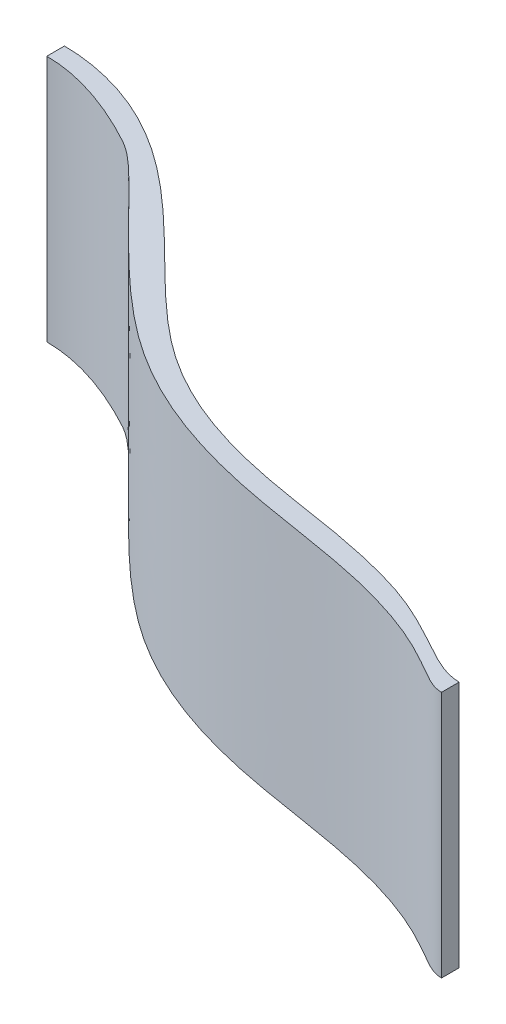
ISO-10303-21;
HEADER;
FILE_DESCRIPTION(('STEP AP214'),'2;1');
FILE_NAME('part.step','',(''),(''),'','','');
FILE_SCHEMA(('AUTOMOTIVE_DESIGN { 1 0 10303 214 1 1 1 1 }'));
ENDSEC;
DATA;
#1=APPLICATION_CONTEXT('core data for automotive mechanical design processes');
#2=APPLICATION_PROTOCOL_DEFINITION('international standard','automotive_design',2000,#1);
#3=PRODUCT_CONTEXT('',#1,'mechanical');
#4=PRODUCT('Part','Part','',(#3));
#5=PRODUCT_RELATED_PRODUCT_CATEGORY('part','',(#4));
#6=PRODUCT_DEFINITION_FORMATION('','',#4);
#7=PRODUCT_DEFINITION_CONTEXT('part definition',#1,'design');
#8=PRODUCT_DEFINITION('design','',#6,#7);
#9=PRODUCT_DEFINITION_SHAPE('','',#8);
#10=(LENGTH_UNIT() NAMED_UNIT(*) SI_UNIT(.MILLI.,.METRE.));
#11=(NAMED_UNIT(*) PLANE_ANGLE_UNIT() SI_UNIT($,.RADIAN.));
#12=(NAMED_UNIT(*) SI_UNIT($,.STERADIAN.) SOLID_ANGLE_UNIT());
#13=UNCERTAINTY_MEASURE_WITH_UNIT(LENGTH_MEASURE(1.E-05),#10,'distance_accuracy_value','');
#14=(GEOMETRIC_REPRESENTATION_CONTEXT(3) GLOBAL_UNCERTAINTY_ASSIGNED_CONTEXT((#13)) GLOBAL_UNIT_ASSIGNED_CONTEXT((#10,
#11,#12)) REPRESENTATION_CONTEXT('',''));
#15=CARTESIAN_POINT('',(0.,0.,0.));
#16=DIRECTION('',(0.,0.,1.));
#17=DIRECTION('',(1.,0.,0.));
#18=AXIS2_PLACEMENT_3D('',#15,#16,#17);
#19=CARTESIAN_POINT('',(0.,420.,-30.));
#20=CARTESIAN_POINT('',(42.1724819660913,420.,-30.));
#21=CARTESIAN_POINT('',(267.885357965047,420.,19.4337878196505));
#22=CARTESIAN_POINT('',(486.469740333777,420.,345.712765109243));
#23=CARTESIAN_POINT('',(745.083096253932,420.,425.526187691134));
#24=CARTESIAN_POINT('',(948.321873855057,420.,455.022483048643));
#25=CARTESIAN_POINT('',(1150.37756470674,420.,495.744478272121));
#26=CARTESIAN_POINT('',(1223.3164034929,420.,570.));
#27=CARTESIAN_POINT('',(1270.,420.,570.));
#28=B_SPLINE_CURVE_WITH_KNOTS('',3,(#19,#20,#21,#22,#23,#24,#25,#26,#27),.UNSPECIFIED.,.F.,.F.,
(4,1,1,1,1,1,4),(0.,0.0847739069405942,0.417203054912309,0.651150272269238,0.68934091943693,
0.799109526589234,1.),.UNSPECIFIED.);
#29=DIRECTION('',(0.,-1.,0.));
#30=VECTOR('',#29,1.);
#31=SURFACE_OF_LINEAR_EXTRUSION('',#28,#30);
#32=CARTESIAN_POINT('',(0.,0.,-30.));
#33=CARTESIAN_POINT('',(42.1724819660913,0.,-30.));
#34=CARTESIAN_POINT('',(267.885357965047,0.,19.4337878196505));
#35=CARTESIAN_POINT('',(486.469740333777,0.,345.712765109243));
#36=CARTESIAN_POINT('',(745.083096253932,0.,425.526187691134));
#37=CARTESIAN_POINT('',(948.321873855057,0.,455.022483048643));
#38=CARTESIAN_POINT('',(1150.37756470674,0.,495.744478272121));
#39=CARTESIAN_POINT('',(1223.3164034929,0.,570.));
#40=CARTESIAN_POINT('',(1270.,0.,570.));
#41=B_SPLINE_CURVE_WITH_KNOTS('',3,(#32,#33,#34,#35,#36,#37,#38,#39,#40),.UNSPECIFIED.,.F.,.F.,
(4,1,1,1,1,1,4),(0.,0.0847739069405942,0.417203054912309,0.651150272269238,0.68934091943693,
0.799109526589234,1.),.UNSPECIFIED.);
#42=CARTESIAN_POINT('',(0.,0.,-30.));
#43=VERTEX_POINT('',#42);
#44=CARTESIAN_POINT('',(1270.,0.,570.));
#45=VERTEX_POINT('',#44);
#46=EDGE_CURVE('E125',#43,#45,#41,.T.);
#47=ORIENTED_EDGE('',*,*,#46,.F.);
#48=DIRECTION('',(0.,-1.,0.));
#49=VECTOR('',#48,1.);
#50=CARTESIAN_POINT('',(0.,420.,-30.));
#51=LINE('',#50,#49);
#52=CARTESIAN_POINT('',(0.,420.,-30.));
#53=VERTEX_POINT('',#52);
#54=EDGE_CURVE('E11',#53,#43,#51,.T.);
#55=ORIENTED_EDGE('',*,*,#54,.F.);
#56=CARTESIAN_POINT('',(1270.,420.,570.));
#57=VERTEX_POINT('',#56);
#58=EDGE_CURVE('E99',#53,#57,#28,.T.);
#59=ORIENTED_EDGE('',*,*,#58,.T.);
#60=DIRECTION('',(0.,-1.,0.));
#61=VECTOR('',#60,1.);
#62=CARTESIAN_POINT('',(1270.,420.,570.));
#63=LINE('',#62,#61);
#64=EDGE_CURVE('E80',#57,#45,#63,.T.);
#65=ORIENTED_EDGE('',*,*,#64,.T.);
#66=EDGE_LOOP('',(#47,#55,#59,#65));
#67=FACE_BOUND('',#66,.T.);
#68=ADVANCED_FACE('F41',(#67),#31,.T.);
#69=CARTESIAN_POINT('',(0.,420.,0.));
#70=DIRECTION('',(-1.,0.,0.));
#71=DIRECTION('',(0.,0.,1.));
#72=AXIS2_PLACEMENT_3D('',#69,#70,#71);
#73=PLANE('',#72);
#74=DIRECTION('',(0.,0.,-1.));
#75=VECTOR('',#74,1.);
#76=CARTESIAN_POINT('',(0.,0.,0.));
#77=LINE('',#76,#75);
#78=CARTESIAN_POINT('',(0.,0.,0.));
#79=VERTEX_POINT('',#78);
#80=EDGE_CURVE('E93',#79,#43,#77,.T.);
#81=ORIENTED_EDGE('',*,*,#80,.F.);
#82=DIRECTION('',(0.,-1.,0.));
#83=VECTOR('',#82,1.);
#84=CARTESIAN_POINT('',(0.,420.,0.));
#85=LINE('',#84,#83);
#86=CARTESIAN_POINT('',(0.,420.,0.));
#87=VERTEX_POINT('',#86);
#88=EDGE_CURVE('E50',#87,#79,#85,.T.);
#89=ORIENTED_EDGE('',*,*,#88,.F.);
#90=DIRECTION('',(0.,0.,-1.));
#91=VECTOR('',#90,1.);
#92=CARTESIAN_POINT('',(0.,420.,0.));
#93=LINE('',#92,#91);
#94=EDGE_CURVE('E91',#87,#53,#93,.T.);
#95=ORIENTED_EDGE('',*,*,#94,.T.);
#96=ORIENTED_EDGE('',*,*,#54,.T.);
#97=EDGE_LOOP('',(#81,#89,#95,#96));
#98=FACE_BOUND('',#97,.T.);
#99=ADVANCED_FACE('F89',(#98),#73,.T.);
#100=CARTESIAN_POINT('',(0.,420.,0.));
#101=CARTESIAN_POINT('',(63.9163152195224,420.,0.));
#102=CARTESIAN_POINT('',(150.210740563594,420.,38.8706557041555));
#103=CARTESIAN_POINT('',(245.199863378563,420.,90.9746521025318));
#104=CARTESIAN_POINT('',(512.561266581365,420.,420.540297934127));
#105=CARTESIAN_POINT('',(858.814807696552,420.,476.037260949209));
#106=CARTESIAN_POINT('',(1192.61413834726,420.,530.302900736237));
#107=CARTESIAN_POINT('',(1228.94531405517,420.,600.000000000001));
#108=CARTESIAN_POINT('',(1270.,420.,600.));
#109=B_SPLINE_CURVE_WITH_KNOTS('',3,(#100,#101,#102,#103,#104,#105,#106,#107,#108),
.UNSPECIFIED.,.F.,.F.,(4,1,1,1,1,1,4),(0.,0.117725014404624,0.147165532644825,0.294405182402003,
0.459333825022082,0.529893306781882,1.),.UNSPECIFIED.);
#110=DIRECTION('',(0.,-1.,0.));
#111=VECTOR('',#110,1.);
#112=SURFACE_OF_LINEAR_EXTRUSION('',#109,#111);
#113=CARTESIAN_POINT('',(0.,0.,0.));
#114=CARTESIAN_POINT('',(63.9163152195224,0.,0.));
#115=CARTESIAN_POINT('',(150.210740563594,0.,38.8706557041555));
#116=CARTESIAN_POINT('',(245.199863378563,0.,90.9746521025318));
#117=CARTESIAN_POINT('',(512.561266581365,0.,420.540297934127));
#118=CARTESIAN_POINT('',(858.814807696552,0.,476.037260949209));
#119=CARTESIAN_POINT('',(1192.61413834726,0.,530.302900736237));
#120=CARTESIAN_POINT('',(1228.94531405517,0.,600.000000000001));
#121=CARTESIAN_POINT('',(1270.,0.,600.));
#122=B_SPLINE_CURVE_WITH_KNOTS('',3,(#113,#114,#115,#116,#117,#118,#119,#120,#121),
.UNSPECIFIED.,.F.,.F.,(4,1,1,1,1,1,4),(0.,0.117725014404624,0.147165532644825,0.294405182402003,
0.459333825022082,0.529893306781882,1.),.UNSPECIFIED.);
#123=CARTESIAN_POINT('',(1270.,0.,600.));
#124=VERTEX_POINT('',#123);
#125=EDGE_CURVE('E73',#79,#124,#122,.T.);
#126=ORIENTED_EDGE('',*,*,#125,.T.);
#127=DIRECTION('',(0.,-1.,0.));
#128=VECTOR('',#127,1.);
#129=CARTESIAN_POINT('',(1270.,420.,600.));
#130=LINE('',#129,#128);
#131=CARTESIAN_POINT('',(1270.,420.,600.));
#132=VERTEX_POINT('',#131);
#133=EDGE_CURVE('E94',#132,#124,#130,.T.);
#134=ORIENTED_EDGE('',*,*,#133,.F.);
#135=EDGE_CURVE('E95',#87,#132,#109,.T.);
#136=ORIENTED_EDGE('',*,*,#135,.F.);
#137=ORIENTED_EDGE('',*,*,#88,.T.);
#138=EDGE_LOOP('',(#126,#134,#136,#137));
#139=FACE_BOUND('',#138,.T.);
#140=ADVANCED_FACE('F96',(#139),#112,.F.);
#141=CARTESIAN_POINT('',(1270.,420.,0.));
#142=DIRECTION('',(-1.,0.,0.));
#143=DIRECTION('',(0.,0.,1.));
#144=AXIS2_PLACEMENT_3D('',#141,#142,#143);
#145=PLANE('',#144);
#146=DIRECTION('',(0.,0.,-1.));
#147=VECTOR('',#146,1.);
#148=CARTESIAN_POINT('',(1270.,0.,0.));
#149=LINE('',#148,#147);
#150=EDGE_CURVE('E101',#124,#45,#149,.T.);
#151=ORIENTED_EDGE('',*,*,#150,.T.);
#152=ORIENTED_EDGE('',*,*,#64,.F.);
#153=DIRECTION('',(0.,0.,-1.));
#154=VECTOR('',#153,1.);
#155=CARTESIAN_POINT('',(1270.,420.,0.));
#156=LINE('',#155,#154);
#157=EDGE_CURVE('E58',#132,#57,#156,.T.);
#158=ORIENTED_EDGE('',*,*,#157,.F.);
#159=ORIENTED_EDGE('',*,*,#133,.T.);
#160=EDGE_LOOP('',(#151,#152,#158,#159));
#161=FACE_BOUND('',#160,.T.);
#162=ADVANCED_FACE('F116',(#161),#145,.F.);
#163=CARTESIAN_POINT('',(0.,420.,0.));
#164=DIRECTION('',(0.,1.,0.));
#165=DIRECTION('',(0.,0.,1.));
#166=AXIS2_PLACEMENT_3D('',#163,#164,#165);
#167=PLANE('',#166);
#168=ORIENTED_EDGE('',*,*,#58,.F.);
#169=ORIENTED_EDGE('',*,*,#94,.F.);
#170=ORIENTED_EDGE('',*,*,#135,.T.);
#171=ORIENTED_EDGE('',*,*,#157,.T.);
#172=EDGE_LOOP('',(#168,#169,#170,#171));
#173=FACE_BOUND('',#172,.T.);
#174=ADVANCED_FACE('F98',(#173),#167,.T.);
#175=CARTESIAN_POINT('',(0.,0.,0.));
#176=DIRECTION('',(0.,1.,0.));
#177=DIRECTION('',(0.,0.,1.));
#178=AXIS2_PLACEMENT_3D('',#175,#176,#177);
#179=PLANE('',#178);
#180=ORIENTED_EDGE('',*,*,#46,.T.);
#181=ORIENTED_EDGE('',*,*,#150,.F.);
#182=ORIENTED_EDGE('',*,*,#125,.F.);
#183=ORIENTED_EDGE('',*,*,#80,.T.);
#184=EDGE_LOOP('',(#180,#181,#182,#183));
#185=FACE_BOUND('',#184,.T.);
#186=ADVANCED_FACE('F128',(#185),#179,.F.);
#187=CLOSED_SHELL('',(#68,#99,#140,#162,#174,#186));
#188=MANIFOLD_SOLID_BREP('B2',#187);
#189=ADVANCED_BREP_SHAPE_REPRESENTATION('',(#18,#188),#14);
#190=SHAPE_DEFINITION_REPRESENTATION(#9,#189);
ENDSEC;
END-ISO-10303-21;
